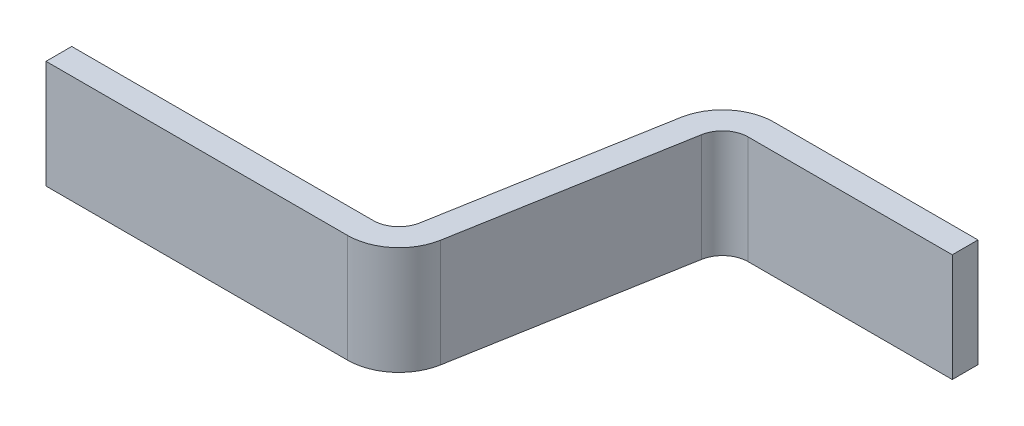
ISO-10303-21;
HEADER;
FILE_DESCRIPTION(('STEP AP214'),'2;1');
FILE_NAME('part.step','',(''),(''),'','','');
FILE_SCHEMA(('AUTOMOTIVE_DESIGN { 1 0 10303 214 1 1 1 1 }'));
ENDSEC;
DATA;
#1=APPLICATION_CONTEXT('core data for automotive mechanical design processes');
#2=APPLICATION_PROTOCOL_DEFINITION('international standard','automotive_design',2000,#1);
#3=PRODUCT_CONTEXT('',#1,'mechanical');
#4=PRODUCT('Part','Part','',(#3));
#5=PRODUCT_RELATED_PRODUCT_CATEGORY('part','',(#4));
#6=PRODUCT_DEFINITION_FORMATION('','',#4);
#7=PRODUCT_DEFINITION_CONTEXT('part definition',#1,'design');
#8=PRODUCT_DEFINITION('design','',#6,#7);
#9=PRODUCT_DEFINITION_SHAPE('','',#8);
#10=(LENGTH_UNIT() NAMED_UNIT(*) SI_UNIT(.MILLI.,.METRE.));
#11=(NAMED_UNIT(*) PLANE_ANGLE_UNIT() SI_UNIT($,.RADIAN.));
#12=(NAMED_UNIT(*) SI_UNIT($,.STERADIAN.) SOLID_ANGLE_UNIT());
#13=UNCERTAINTY_MEASURE_WITH_UNIT(LENGTH_MEASURE(1.E-05),#10,'distance_accuracy_value','');
#14=(GEOMETRIC_REPRESENTATION_CONTEXT(3) GLOBAL_UNCERTAINTY_ASSIGNED_CONTEXT((#13)) GLOBAL_UNIT_ASSIGNED_CONTEXT((#10,
#11,#12)) REPRESENTATION_CONTEXT('',''));
#15=CARTESIAN_POINT('',(0.,0.,0.));
#16=DIRECTION('',(0.,0.,1.));
#17=DIRECTION('',(1.,0.,0.));
#18=AXIS2_PLACEMENT_3D('',#15,#16,#17);
#19=CARTESIAN_POINT('',(4.825,-0.42,0.));
#20=DIRECTION('',(-1.,0.,0.));
#21=DIRECTION('',(0.,0.,1.));
#22=AXIS2_PLACEMENT_3D('',#19,#20,#21);
#23=PLANE('',#22);
#24=DIRECTION('',(0.,0.,1.));
#25=VECTOR('',#24,1.);
#26=CARTESIAN_POINT('',(4.825,0.42,0.));
#27=LINE('',#26,#25);
#28=CARTESIAN_POINT('',(4.825,0.42,0.2));
#29=VERTEX_POINT('',#28);
#30=CARTESIAN_POINT('',(4.825,0.42,0.));
#31=VERTEX_POINT('',#30);
#32=EDGE_CURVE('E146',#29,#31,#27,.F.);
#33=ORIENTED_EDGE('',*,*,#32,.F.);
#34=DIRECTION('',(0.,1.,0.));
#35=VECTOR('',#34,1.);
#36=CARTESIAN_POINT('',(4.825,0.42,0.2));
#37=LINE('',#36,#35);
#38=CARTESIAN_POINT('',(4.825,-0.42,0.2));
#39=VERTEX_POINT('',#38);
#40=EDGE_CURVE('E110',#29,#39,#37,.F.);
#41=ORIENTED_EDGE('',*,*,#40,.T.);
#42=DIRECTION('',(0.,0.,1.));
#43=VECTOR('',#42,1.);
#44=CARTESIAN_POINT('',(4.825,-0.42,0.));
#45=LINE('',#44,#43);
#46=CARTESIAN_POINT('',(4.825,-0.42,0.));
#47=VERTEX_POINT('',#46);
#48=EDGE_CURVE('E154',#47,#39,#45,.T.);
#49=ORIENTED_EDGE('',*,*,#48,.F.);
#50=DIRECTION('',(0.,1.,0.));
#51=VECTOR('',#50,1.);
#52=CARTESIAN_POINT('',(4.825,-0.42,0.));
#53=LINE('',#52,#51);
#54=EDGE_CURVE('E133',#47,#31,#53,.T.);
#55=ORIENTED_EDGE('',*,*,#54,.T.);
#56=EDGE_LOOP('',(#33,#41,#49,#55));
#57=FACE_BOUND('',#56,.T.);
#58=ADVANCED_FACE('F17',(#57),#23,.F.);
#59=CARTESIAN_POINT('',(3.238923101205,-0.42,0.));
#60=DIRECTION('',(0.,0.,1.));
#61=DIRECTION('',(1.,0.,0.));
#62=AXIS2_PLACEMENT_3D('',#59,#60,#61);
#63=PLANE('',#62);
#64=DIRECTION('',(1.,0.,0.));
#65=VECTOR('',#64,1.);
#66=CARTESIAN_POINT('',(3.238923101205,-0.42,0.));
#67=LINE('',#66,#65);
#68=CARTESIAN_POINT('',(3.238923101205,-0.42,0.));
#69=VERTEX_POINT('',#68);
#70=EDGE_CURVE('E140',#69,#47,#67,.T.);
#71=ORIENTED_EDGE('',*,*,#70,.F.);
#72=DIRECTION('',(0.,-1.,0.));
#73=VECTOR('',#72,1.);
#74=CARTESIAN_POINT('',(3.238923101205,-0.42,0.));
#75=LINE('',#74,#73);
#76=CARTESIAN_POINT('',(3.238923101205,0.42,0.));
#77=VERTEX_POINT('',#76);
#78=EDGE_CURVE('E109',#77,#69,#75,.T.);
#79=ORIENTED_EDGE('',*,*,#78,.F.);
#80=DIRECTION('',(1.,0.,0.));
#81=VECTOR('',#80,1.);
#82=CARTESIAN_POINT('',(3.238923101205,0.42,0.));
#83=LINE('',#82,#81);
#84=EDGE_CURVE('E105',#31,#77,#83,.F.);
#85=ORIENTED_EDGE('',*,*,#84,.F.);
#86=ORIENTED_EDGE('',*,*,#54,.F.);
#87=EDGE_LOOP('',(#71,#79,#85,#86));
#88=FACE_BOUND('',#87,.T.);
#89=ADVANCED_FACE('F259',(#88),#63,.F.);
#90=CARTESIAN_POINT('',(3.238923101205,0.42,0.2));
#91=DIRECTION('',(0.,0.,-1.));
#92=DIRECTION('',(-1.,0.,0.));
#93=AXIS2_PLACEMENT_3D('',#90,#91,#92);
#94=PLANE('',#93);
#95=DIRECTION('',(-1.,0.,0.));
#96=VECTOR('',#95,1.);
#97=CARTESIAN_POINT('',(3.238923101205,0.42,0.2));
#98=LINE('',#97,#96);
#99=CARTESIAN_POINT('',(3.238923101205,0.42,0.2));
#100=VERTEX_POINT('',#99);
#101=EDGE_CURVE('E132',#100,#29,#98,.F.);
#102=ORIENTED_EDGE('',*,*,#101,.F.);
#103=DIRECTION('',(0.,-1.,0.));
#104=VECTOR('',#103,1.);
#105=CARTESIAN_POINT('',(3.238923101205,0.42,0.2));
#106=LINE('',#105,#104);
#107=CARTESIAN_POINT('',(3.238923101205,-0.42,0.2));
#108=VERTEX_POINT('',#107);
#109=EDGE_CURVE('E97',#100,#108,#106,.T.);
#110=ORIENTED_EDGE('',*,*,#109,.T.);
#111=DIRECTION('',(-1.,0.,0.));
#112=VECTOR('',#111,1.);
#113=CARTESIAN_POINT('',(3.238923101205,-0.42,0.2));
#114=LINE('',#113,#112);
#115=EDGE_CURVE('E130',#39,#108,#114,.T.);
#116=ORIENTED_EDGE('',*,*,#115,.F.);
#117=ORIENTED_EDGE('',*,*,#40,.F.);
#118=EDGE_LOOP('',(#102,#110,#116,#117));
#119=FACE_BOUND('',#118,.T.);
#120=ADVANCED_FACE('F260',(#119),#94,.F.);
#121=CARTESIAN_POINT('',(3.238923101205,-0.42,0.4));
#122=DIRECTION('',(0.,-1.,0.));
#123=DIRECTION('',(0.,0.,-1.));
#124=AXIS2_PLACEMENT_3D('',#121,#122,#123);
#125=CYLINDRICAL_SURFACE('',#124,0.4);
#126=CARTESIAN_POINT('',(3.238923101205,-0.42,0.4));
#127=DIRECTION('',(0.,-1.,0.));
#128=DIRECTION('',(0.,0.,-1.));
#129=AXIS2_PLACEMENT_3D('',#126,#127,#128);
#130=CIRCLE('',#129,0.4);
#131=CARTESIAN_POINT('',(2.84500000000006,-0.42,0.330540728933093));
#132=VERTEX_POINT('',#131);
#133=EDGE_CURVE('E114',#132,#69,#130,.T.);
#134=ORIENTED_EDGE('',*,*,#133,.F.);
#135=DIRECTION('',(0.,1.,0.));
#136=VECTOR('',#135,1.);
#137=CARTESIAN_POINT('',(2.84499999999999,-0.42,0.330540728932998));
#138=LINE('',#137,#136);
#139=CARTESIAN_POINT('',(2.84500000000006,0.42,0.330540728933093));
#140=VERTEX_POINT('',#139);
#141=EDGE_CURVE('E91',#132,#140,#138,.T.);
#142=ORIENTED_EDGE('',*,*,#141,.T.);
#143=CARTESIAN_POINT('',(3.238923101205,0.42,0.4));
#144=DIRECTION('',(0.,-1.,0.));
#145=DIRECTION('',(0.,0.,-1.));
#146=AXIS2_PLACEMENT_3D('',#143,#144,#145);
#147=CIRCLE('',#146,0.4);
#148=EDGE_CURVE('E20',#140,#77,#147,.T.);
#149=ORIENTED_EDGE('',*,*,#148,.T.);
#150=ORIENTED_EDGE('',*,*,#78,.T.);
#151=EDGE_LOOP('',(#134,#142,#149,#150));
#152=FACE_BOUND('',#151,.T.);
#153=ADVANCED_FACE('F112',(#152),#125,.T.);
#154=CARTESIAN_POINT('',(3.238923101205,0.42,0.4));
#155=DIRECTION('',(0.,-1.,0.));
#156=DIRECTION('',(0.,0.,-1.));
#157=AXIS2_PLACEMENT_3D('',#154,#155,#156);
#158=CYLINDRICAL_SURFACE('',#157,0.2);
#159=CARTESIAN_POINT('',(3.238923101205,0.42,0.4));
#160=DIRECTION('',(0.,-1.,0.));
#161=DIRECTION('',(0.,0.,-1.));
#162=AXIS2_PLACEMENT_3D('',#159,#160,#161);
#163=CIRCLE('',#162,0.2);
#164=CARTESIAN_POINT('',(3.04196155060276,0.42,0.365270364466882));
#165=VERTEX_POINT('',#164);
#166=EDGE_CURVE('E126',#165,#100,#163,.T.);
#167=ORIENTED_EDGE('',*,*,#166,.F.);
#168=DIRECTION('',(0.,1.,0.));
#169=VECTOR('',#168,1.);
#170=CARTESIAN_POINT('',(3.04196155060296,0.42,0.365270364467169));
#171=LINE('',#170,#169);
#172=CARTESIAN_POINT('',(3.04196155060252,-0.42,0.365270364466895));
#173=VERTEX_POINT('',#172);
#174=EDGE_CURVE('E122',#165,#173,#171,.F.);
#175=ORIENTED_EDGE('',*,*,#174,.T.);
#176=CARTESIAN_POINT('',(3.238923101205,-0.42,0.4));
#177=DIRECTION('',(0.,-1.,0.));
#178=DIRECTION('',(0.,0.,-1.));
#179=AXIS2_PLACEMENT_3D('',#176,#177,#178);
#180=CIRCLE('',#179,0.2);
#181=EDGE_CURVE('E176',#108,#173,#180,.F.);
#182=ORIENTED_EDGE('',*,*,#181,.F.);
#183=ORIENTED_EDGE('',*,*,#109,.F.);
#184=EDGE_LOOP('',(#167,#175,#182,#183));
#185=FACE_BOUND('',#184,.T.);
#186=ADVANCED_FACE('F186',(#185),#158,.F.);
#187=CARTESIAN_POINT('',(2.540978975928,-0.42,2.054729635533));
#188=DIRECTION('',(0.98480775301219,0.,0.173648177667033));
#189=DIRECTION('',(0.173648177667033,0.,-0.98480775301219));
#190=AXIS2_PLACEMENT_3D('',#187,#188,#189);
#191=PLANE('',#190);
#192=DIRECTION('',(-0.173648177667037,0.,0.984807753012189));
#193=VECTOR('',#192,1.);
#194=CARTESIAN_POINT('',(2.845,-0.42,0.330540728933));
#195=LINE('',#194,#193);
#196=CARTESIAN_POINT('',(2.54097897592822,-0.42,2.0547296355332));
#197=VERTEX_POINT('',#196);
#198=EDGE_CURVE('E178',#132,#197,#195,.T.);
#199=ORIENTED_EDGE('',*,*,#198,.T.);
#200=DIRECTION('',(0.,1.,0.));
#201=VECTOR('',#200,1.);
#202=CARTESIAN_POINT('',(2.540978975928,-0.42,2.054729635533));
#203=LINE('',#202,#201);
#204=CARTESIAN_POINT('',(2.54097897592822,0.42,2.0547296355332));
#205=VERTEX_POINT('',#204);
#206=EDGE_CURVE('E93',#205,#197,#203,.F.);
#207=ORIENTED_EDGE('',*,*,#206,.F.);
#208=DIRECTION('',(0.173648177667033,0.,-0.98480775301219));
#209=VECTOR('',#208,1.);
#210=CARTESIAN_POINT('',(2.540978975928,0.42,2.054729635533));
#211=LINE('',#210,#209);
#212=EDGE_CURVE('E86',#140,#205,#211,.F.);
#213=ORIENTED_EDGE('',*,*,#212,.F.);
#214=ORIENTED_EDGE('',*,*,#141,.F.);
#215=EDGE_LOOP('',(#199,#207,#213,#214));
#216=FACE_BOUND('',#215,.T.);
#217=ADVANCED_FACE('F89',(#216),#191,.F.);
#218=CARTESIAN_POINT('',(2.737940526531,0.42,2.089459271067));
#219=DIRECTION('',(-0.98480775301219,0.,-0.173648177667033));
#220=DIRECTION('',(-0.173648177667033,0.,0.98480775301219));
#221=AXIS2_PLACEMENT_3D('',#218,#219,#220);
#222=PLANE('',#221);
#223=DIRECTION('',(-0.173648177667033,0.,0.98480775301219));
#224=VECTOR('',#223,1.);
#225=CARTESIAN_POINT('',(2.737940526531,0.42,2.089459271067));
#226=LINE('',#225,#224);
#227=CARTESIAN_POINT('',(2.73794052653094,0.42,2.08945927106691));
#228=VERTEX_POINT('',#227);
#229=EDGE_CURVE('E118',#228,#165,#226,.F.);
#230=ORIENTED_EDGE('',*,*,#229,.F.);
#231=DIRECTION('',(0.,1.,0.));
#232=VECTOR('',#231,1.);
#233=CARTESIAN_POINT('',(2.737940526531,0.42,2.089459271067));
#234=LINE('',#233,#232);
#235=CARTESIAN_POINT('',(2.73794052653096,-0.42,2.0894592710668));
#236=VERTEX_POINT('',#235);
#237=EDGE_CURVE('E115',#236,#228,#234,.T.);
#238=ORIENTED_EDGE('',*,*,#237,.F.);
#239=DIRECTION('',(0.173648177666483,0.,-0.984807753012287));
#240=VECTOR('',#239,1.);
#241=CARTESIAN_POINT('',(2.737940526531,-0.42,2.089459271067));
#242=LINE('',#241,#240);
#243=EDGE_CURVE('E192',#236,#173,#242,.T.);
#244=ORIENTED_EDGE('',*,*,#243,.T.);
#245=ORIENTED_EDGE('',*,*,#174,.F.);
#246=EDGE_LOOP('',(#230,#238,#244,#245));
#247=FACE_BOUND('',#246,.T.);
#248=ADVANCED_FACE('F190',(#247),#222,.F.);
#249=CARTESIAN_POINT('',(2.344017425326,0.42,2.02));
#250=DIRECTION('',(0.,1.,0.));
#251=DIRECTION('',(0.,0.,1.));
#252=AXIS2_PLACEMENT_3D('',#249,#250,#251);
#253=CYLINDRICAL_SURFACE('',#252,0.4);
#254=CARTESIAN_POINT('',(2.344017425326,0.42,2.02));
#255=DIRECTION('',(0.,1.,0.));
#256=DIRECTION('',(0.,0.,1.));
#257=AXIS2_PLACEMENT_3D('',#254,#255,#256);
#258=CIRCLE('',#257,0.4);
#259=CARTESIAN_POINT('',(2.344017425326,0.42,2.42));
#260=VERTEX_POINT('',#259);
#261=EDGE_CURVE('E173',#260,#228,#258,.T.);
#262=ORIENTED_EDGE('',*,*,#261,.F.);
#263=DIRECTION('',(0.,1.,0.));
#264=VECTOR('',#263,1.);
#265=CARTESIAN_POINT('',(2.344017425326,0.42,2.42));
#266=LINE('',#265,#264);
#267=CARTESIAN_POINT('',(2.344017425326,-0.42,2.42));
#268=VERTEX_POINT('',#267);
#269=EDGE_CURVE('E175',#260,#268,#266,.F.);
#270=ORIENTED_EDGE('',*,*,#269,.T.);
#271=CARTESIAN_POINT('',(2.344017425326,-0.42,2.02));
#272=DIRECTION('',(0.,1.,0.));
#273=DIRECTION('',(0.,0.,1.));
#274=AXIS2_PLACEMENT_3D('',#271,#272,#273);
#275=CIRCLE('',#274,0.4);
#276=EDGE_CURVE('E170',#236,#268,#275,.F.);
#277=ORIENTED_EDGE('',*,*,#276,.F.);
#278=ORIENTED_EDGE('',*,*,#237,.T.);
#279=EDGE_LOOP('',(#262,#270,#277,#278));
#280=FACE_BOUND('',#279,.T.);
#281=ADVANCED_FACE('F286',(#280),#253,.T.);
#282=CARTESIAN_POINT('',(0.,0.42,2.42));
#283=DIRECTION('',(0.,0.,-1.));
#284=DIRECTION('',(-1.,0.,0.));
#285=AXIS2_PLACEMENT_3D('',#282,#283,#284);
#286=PLANE('',#285);
#287=DIRECTION('',(1.,0.,0.));
#288=VECTOR('',#287,1.);
#289=CARTESIAN_POINT('',(0.,0.42,2.42));
#290=LINE('',#289,#288);
#291=CARTESIAN_POINT('',(0.,0.42,2.42));
#292=VERTEX_POINT('',#291);
#293=EDGE_CURVE('E172',#260,#292,#290,.F.);
#294=ORIENTED_EDGE('',*,*,#293,.T.);
#295=DIRECTION('',(0.,1.,0.));
#296=VECTOR('',#295,1.);
#297=CARTESIAN_POINT('',(0.,-0.42,2.42));
#298=LINE('',#297,#296);
#299=CARTESIAN_POINT('',(0.,-0.42,2.42));
#300=VERTEX_POINT('',#299);
#301=EDGE_CURVE('E206',#300,#292,#298,.T.);
#302=ORIENTED_EDGE('',*,*,#301,.F.);
#303=DIRECTION('',(1.,0.,0.));
#304=VECTOR('',#303,1.);
#305=CARTESIAN_POINT('',(0.,-0.42,2.42));
#306=LINE('',#305,#304);
#307=EDGE_CURVE('E169',#300,#268,#306,.T.);
#308=ORIENTED_EDGE('',*,*,#307,.T.);
#309=ORIENTED_EDGE('',*,*,#269,.F.);
#310=EDGE_LOOP('',(#294,#302,#308,#309));
#311=FACE_BOUND('',#310,.T.);
#312=ADVANCED_FACE('F283',(#311),#286,.F.);
#313=CARTESIAN_POINT('',(0.,0.42,2.22));
#314=DIRECTION('',(0.,-1.,0.));
#315=DIRECTION('',(0.,0.,-1.));
#316=AXIS2_PLACEMENT_3D('',#313,#314,#315);
#317=PLANE('',#316);
#318=DIRECTION('',(1.,0.,0.));
#319=VECTOR('',#318,1.);
#320=CARTESIAN_POINT('',(0.,0.42,2.22));
#321=LINE('',#320,#319);
#322=CARTESIAN_POINT('',(2.344017425326,0.42,2.22));
#323=VERTEX_POINT('',#322);
#324=CARTESIAN_POINT('',(0.,0.42,2.22));
#325=VERTEX_POINT('',#324);
#326=EDGE_CURVE('E166',#323,#325,#321,.F.);
#327=ORIENTED_EDGE('',*,*,#326,.T.);
#328=DIRECTION('',(0.,0.,1.));
#329=VECTOR('',#328,1.);
#330=CARTESIAN_POINT('',(0.,0.42,2.22));
#331=LINE('',#330,#329);
#332=EDGE_CURVE('E202',#292,#325,#331,.F.);
#333=ORIENTED_EDGE('',*,*,#332,.F.);
#334=ORIENTED_EDGE('',*,*,#293,.F.);
#335=ORIENTED_EDGE('',*,*,#261,.T.);
#336=ORIENTED_EDGE('',*,*,#229,.T.);
#337=ORIENTED_EDGE('',*,*,#166,.T.);
#338=ORIENTED_EDGE('',*,*,#101,.T.);
#339=ORIENTED_EDGE('',*,*,#32,.T.);
#340=ORIENTED_EDGE('',*,*,#84,.T.);
#341=ORIENTED_EDGE('',*,*,#148,.F.);
#342=ORIENTED_EDGE('',*,*,#212,.T.);
#343=CARTESIAN_POINT('',(2.344017425326,0.42,2.02));
#344=DIRECTION('',(0.,1.,0.));
#345=DIRECTION('',(0.,0.,1.));
#346=AXIS2_PLACEMENT_3D('',#343,#344,#345);
#347=CIRCLE('',#346,0.2);
#348=EDGE_CURVE('E167',#205,#323,#347,.F.);
#349=ORIENTED_EDGE('',*,*,#348,.T.);
#350=EDGE_LOOP('',(#327,#333,#334,#335,#336,#337,#338,#339,#340,#341,#342,#349));
#351=FACE_BOUND('',#350,.T.);
#352=ADVANCED_FACE('F102',(#351),#317,.F.);
#353=CARTESIAN_POINT('',(0.,-0.42,2.22));
#354=DIRECTION('',(-1.,0.,0.));
#355=DIRECTION('',(0.,0.,1.));
#356=AXIS2_PLACEMENT_3D('',#353,#354,#355);
#357=PLANE('',#356);
#358=ORIENTED_EDGE('',*,*,#332,.T.);
#359=DIRECTION('',(0.,1.,0.));
#360=VECTOR('',#359,1.);
#361=CARTESIAN_POINT('',(0.,-0.42,2.22));
#362=LINE('',#361,#360);
#363=CARTESIAN_POINT('',(0.,-0.42,2.22));
#364=VERTEX_POINT('',#363);
#365=EDGE_CURVE('E213',#325,#364,#362,.F.);
#366=ORIENTED_EDGE('',*,*,#365,.T.);
#367=DIRECTION('',(0.,0.,1.));
#368=VECTOR('',#367,1.);
#369=CARTESIAN_POINT('',(0.,-0.42,2.42));
#370=LINE('',#369,#368);
#371=EDGE_CURVE('E205',#364,#300,#370,.T.);
#372=ORIENTED_EDGE('',*,*,#371,.T.);
#373=ORIENTED_EDGE('',*,*,#301,.T.);
#374=EDGE_LOOP('',(#358,#366,#372,#373));
#375=FACE_BOUND('',#374,.T.);
#376=ADVANCED_FACE('F239',(#375),#357,.T.);
#377=CARTESIAN_POINT('',(0.,-0.42,2.42));
#378=DIRECTION('',(0.,1.,0.));
#379=DIRECTION('',(0.,0.,1.));
#380=AXIS2_PLACEMENT_3D('',#377,#378,#379);
#381=PLANE('',#380);
#382=ORIENTED_EDGE('',*,*,#307,.F.);
#383=ORIENTED_EDGE('',*,*,#371,.F.);
#384=DIRECTION('',(1.,0.,0.));
#385=VECTOR('',#384,1.);
#386=CARTESIAN_POINT('',(0.,-0.42,2.22));
#387=LINE('',#386,#385);
#388=CARTESIAN_POINT('',(2.344017425326,-0.42,2.22));
#389=VERTEX_POINT('',#388);
#390=EDGE_CURVE('E26',#364,#389,#387,.T.);
#391=ORIENTED_EDGE('',*,*,#390,.T.);
#392=CARTESIAN_POINT('',(2.344017425326,-0.42,2.02));
#393=DIRECTION('',(0.,1.,0.));
#394=DIRECTION('',(0.,0.,1.));
#395=AXIS2_PLACEMENT_3D('',#392,#393,#394);
#396=CIRCLE('',#395,0.2);
#397=EDGE_CURVE('E34',#389,#197,#396,.T.);
#398=ORIENTED_EDGE('',*,*,#397,.T.);
#399=ORIENTED_EDGE('',*,*,#198,.F.);
#400=ORIENTED_EDGE('',*,*,#133,.T.);
#401=ORIENTED_EDGE('',*,*,#70,.T.);
#402=ORIENTED_EDGE('',*,*,#48,.T.);
#403=ORIENTED_EDGE('',*,*,#115,.T.);
#404=ORIENTED_EDGE('',*,*,#181,.T.);
#405=ORIENTED_EDGE('',*,*,#243,.F.);
#406=ORIENTED_EDGE('',*,*,#276,.T.);
#407=EDGE_LOOP('',(#382,#383,#391,#398,#399,#400,#401,#402,#403,#404,#405,#406));
#408=FACE_BOUND('',#407,.T.);
#409=ADVANCED_FACE('F234',(#408),#381,.F.);
#410=CARTESIAN_POINT('',(2.344017425326,-0.42,2.02));
#411=DIRECTION('',(0.,1.,0.));
#412=DIRECTION('',(0.,0.,1.));
#413=AXIS2_PLACEMENT_3D('',#410,#411,#412);
#414=CYLINDRICAL_SURFACE('',#413,0.2);
#415=ORIENTED_EDGE('',*,*,#397,.F.);
#416=DIRECTION('',(0.,1.,0.));
#417=VECTOR('',#416,1.);
#418=CARTESIAN_POINT('',(2.344017425326,-0.42,2.22));
#419=LINE('',#418,#417);
#420=EDGE_CURVE('E11',#389,#323,#419,.T.);
#421=ORIENTED_EDGE('',*,*,#420,.T.);
#422=ORIENTED_EDGE('',*,*,#348,.F.);
#423=ORIENTED_EDGE('',*,*,#206,.T.);
#424=EDGE_LOOP('',(#415,#421,#422,#423));
#425=FACE_BOUND('',#424,.T.);
#426=ADVANCED_FACE('F270',(#425),#414,.F.);
#427=CARTESIAN_POINT('',(0.,-0.42,2.22));
#428=DIRECTION('',(0.,0.,1.));
#429=DIRECTION('',(1.,0.,0.));
#430=AXIS2_PLACEMENT_3D('',#427,#428,#429);
#431=PLANE('',#430);
#432=ORIENTED_EDGE('',*,*,#390,.F.);
#433=ORIENTED_EDGE('',*,*,#365,.F.);
#434=ORIENTED_EDGE('',*,*,#326,.F.);
#435=ORIENTED_EDGE('',*,*,#420,.F.);
#436=EDGE_LOOP('',(#432,#433,#434,#435));
#437=FACE_BOUND('',#436,.T.);
#438=ADVANCED_FACE('F237',(#437),#431,.F.);
#439=CLOSED_SHELL('',(#58,#89,#120,#153,#186,#217,#248,#281,#312,#352,#376,#409,#426,#438));
#440=MANIFOLD_SOLID_BREP('B1',#439);
#441=ADVANCED_BREP_SHAPE_REPRESENTATION('',(#18,#440),#14);
#442=SHAPE_DEFINITION_REPRESENTATION(#9,#441);
ENDSEC;
END-ISO-10303-21;
